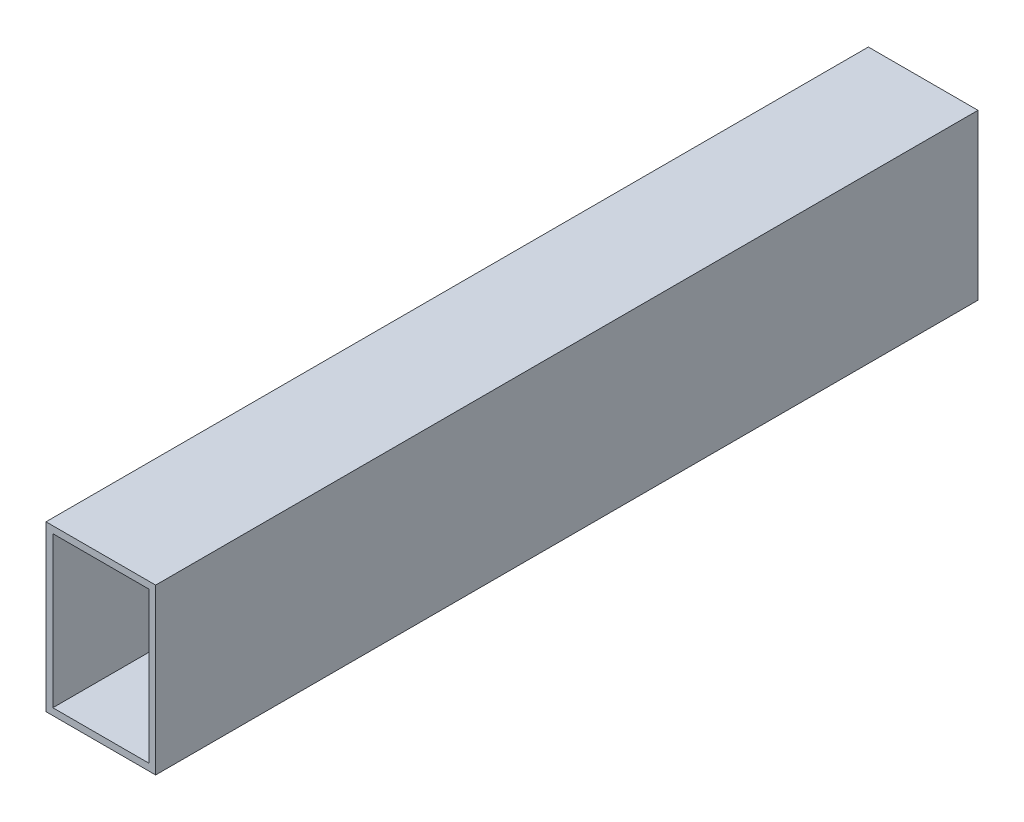
ISO-10303-21;
HEADER;
FILE_DESCRIPTION(('STEP AP214'),'2;1');
FILE_NAME('part.step','',(''),(''),'','','');
FILE_SCHEMA(('AUTOMOTIVE_DESIGN { 1 0 10303 214 1 1 1 1 }'));
ENDSEC;
DATA;
#1=APPLICATION_CONTEXT('core data for automotive mechanical design processes');
#2=APPLICATION_PROTOCOL_DEFINITION('international standard','automotive_design',2000,#1);
#3=PRODUCT_CONTEXT('',#1,'mechanical');
#4=PRODUCT('Part','Part','',(#3));
#5=PRODUCT_RELATED_PRODUCT_CATEGORY('part','',(#4));
#6=PRODUCT_DEFINITION_FORMATION('','',#4);
#7=PRODUCT_DEFINITION_CONTEXT('part definition',#1,'design');
#8=PRODUCT_DEFINITION('design','',#6,#7);
#9=PRODUCT_DEFINITION_SHAPE('','',#8);
#10=(LENGTH_UNIT() NAMED_UNIT(*) SI_UNIT(.MILLI.,.METRE.));
#11=(NAMED_UNIT(*) PLANE_ANGLE_UNIT() SI_UNIT($,.RADIAN.));
#12=(NAMED_UNIT(*) SI_UNIT($,.STERADIAN.) SOLID_ANGLE_UNIT());
#13=UNCERTAINTY_MEASURE_WITH_UNIT(LENGTH_MEASURE(1.E-05),#10,'distance_accuracy_value','');
#14=(GEOMETRIC_REPRESENTATION_CONTEXT(3) GLOBAL_UNCERTAINTY_ASSIGNED_CONTEXT((#13)) GLOBAL_UNIT_ASSIGNED_CONTEXT((#10,
#11,#12)) REPRESENTATION_CONTEXT('',''));
#15=CARTESIAN_POINT('',(0.,0.,0.));
#16=DIRECTION('',(0.,0.,1.));
#17=DIRECTION('',(1.,0.,0.));
#18=AXIS2_PLACEMENT_3D('',#15,#16,#17);
#19=CARTESIAN_POINT('',(0.,0.,381.));
#20=DIRECTION('',(0.,0.,1.));
#21=DIRECTION('',(1.,0.,0.));
#22=AXIS2_PLACEMENT_3D('',#19,#20,#21);
#23=PLANE('',#22);
#24=DIRECTION('',(0.,1.,0.));
#25=VECTOR('',#24,1.);
#26=CARTESIAN_POINT('',(25.4,38.1,381.));
#27=LINE('',#26,#25);
#28=CARTESIAN_POINT('',(25.4,-38.1,381.));
#29=VERTEX_POINT('',#28);
#30=CARTESIAN_POINT('',(25.4,38.1,381.));
#31=VERTEX_POINT('',#30);
#32=EDGE_CURVE('E153',#29,#31,#27,.T.);
#33=ORIENTED_EDGE('',*,*,#32,.T.);
#34=DIRECTION('',(-1.,0.,0.));
#35=VECTOR('',#34,1.);
#36=CARTESIAN_POINT('',(-25.4,38.1,381.));
#37=LINE('',#36,#35);
#38=CARTESIAN_POINT('',(-25.4,38.1,381.));
#39=VERTEX_POINT('',#38);
#40=EDGE_CURVE('E157',#31,#39,#37,.T.);
#41=ORIENTED_EDGE('',*,*,#40,.T.);
#42=DIRECTION('',(0.,-1.,0.));
#43=VECTOR('',#42,1.);
#44=CARTESIAN_POINT('',(-25.4,38.1,381.));
#45=LINE('',#44,#43);
#46=CARTESIAN_POINT('',(-25.3999999999999,-38.1,381.));
#47=VERTEX_POINT('',#46);
#48=EDGE_CURVE('E161',#39,#47,#45,.T.);
#49=ORIENTED_EDGE('',*,*,#48,.T.);
#50=DIRECTION('',(1.,0.,0.));
#51=VECTOR('',#50,1.);
#52=CARTESIAN_POINT('',(-25.3999999999999,-38.1,381.));
#53=LINE('',#52,#51);
#54=EDGE_CURVE('E164',#47,#29,#53,.T.);
#55=ORIENTED_EDGE('',*,*,#54,.T.);
#56=EDGE_LOOP('',(#33,#41,#49,#55));
#57=FACE_BOUND('',#56,.T.);
#58=DIRECTION('',(1.,0.,0.));
#59=VECTOR('',#58,1.);
#60=CARTESIAN_POINT('',(-22.225,-34.925,381.));
#61=LINE('',#60,#59);
#62=CARTESIAN_POINT('',(-22.225,-34.925,381.));
#63=VERTEX_POINT('',#62);
#64=CARTESIAN_POINT('',(22.225,-34.925,381.));
#65=VERTEX_POINT('',#64);
#66=EDGE_CURVE('E114',#63,#65,#61,.T.);
#67=ORIENTED_EDGE('',*,*,#66,.F.);
#68=DIRECTION('',(0.,-1.,0.));
#69=VECTOR('',#68,1.);
#70=CARTESIAN_POINT('',(-22.225,34.925,381.));
#71=LINE('',#70,#69);
#72=CARTESIAN_POINT('',(-22.225,34.925,381.));
#73=VERTEX_POINT('',#72);
#74=EDGE_CURVE('E105',#73,#63,#71,.T.);
#75=ORIENTED_EDGE('',*,*,#74,.F.);
#76=DIRECTION('',(-1.,0.,0.));
#77=VECTOR('',#76,1.);
#78=CARTESIAN_POINT('',(-22.225,34.925,381.));
#79=LINE('',#78,#77);
#80=CARTESIAN_POINT('',(22.225,34.925,381.));
#81=VERTEX_POINT('',#80);
#82=EDGE_CURVE('E131',#81,#73,#79,.T.);
#83=ORIENTED_EDGE('',*,*,#82,.F.);
#84=DIRECTION('',(0.,1.,0.));
#85=VECTOR('',#84,1.);
#86=CARTESIAN_POINT('',(22.225,34.925,381.));
#87=LINE('',#86,#85);
#88=EDGE_CURVE('E127',#65,#81,#87,.T.);
#89=ORIENTED_EDGE('',*,*,#88,.F.);
#90=EDGE_LOOP('',(#67,#75,#83,#89));
#91=FACE_BOUND('',#90,.T.);
#92=ADVANCED_FACE('F39',(#57,#91),#23,.T.);
#93=CARTESIAN_POINT('',(0.,0.,0.));
#94=DIRECTION('',(0.,0.,1.));
#95=DIRECTION('',(1.,0.,0.));
#96=AXIS2_PLACEMENT_3D('',#93,#94,#95);
#97=PLANE('',#96);
#98=DIRECTION('',(0.,1.,0.));
#99=VECTOR('',#98,1.);
#100=CARTESIAN_POINT('',(25.4,38.1,0.));
#101=LINE('',#100,#99);
#102=CARTESIAN_POINT('',(25.4,-38.1,0.));
#103=VERTEX_POINT('',#102);
#104=CARTESIAN_POINT('',(25.4,38.1,0.));
#105=VERTEX_POINT('',#104);
#106=EDGE_CURVE('E123',#103,#105,#101,.T.);
#107=ORIENTED_EDGE('',*,*,#106,.F.);
#108=DIRECTION('',(1.,0.,0.));
#109=VECTOR('',#108,1.);
#110=CARTESIAN_POINT('',(-25.3999999999999,-38.1,0.));
#111=LINE('',#110,#109);
#112=CARTESIAN_POINT('',(-25.3999999999999,-38.1,0.));
#113=VERTEX_POINT('',#112);
#114=EDGE_CURVE('E158',#113,#103,#111,.T.);
#115=ORIENTED_EDGE('',*,*,#114,.F.);
#116=DIRECTION('',(0.,-1.,0.));
#117=VECTOR('',#116,1.);
#118=CARTESIAN_POINT('',(-25.4,38.1,0.));
#119=LINE('',#118,#117);
#120=CARTESIAN_POINT('',(-25.4,38.1,0.));
#121=VERTEX_POINT('',#120);
#122=EDGE_CURVE('E174',#121,#113,#119,.T.);
#123=ORIENTED_EDGE('',*,*,#122,.F.);
#124=DIRECTION('',(-1.,0.,0.));
#125=VECTOR('',#124,1.);
#126=CARTESIAN_POINT('',(-25.4,38.1,0.));
#127=LINE('',#126,#125);
#128=EDGE_CURVE('E171',#105,#121,#127,.T.);
#129=ORIENTED_EDGE('',*,*,#128,.F.);
#130=EDGE_LOOP('',(#107,#115,#123,#129));
#131=FACE_BOUND('',#130,.T.);
#132=DIRECTION('',(0.,-1.,0.));
#133=VECTOR('',#132,1.);
#134=CARTESIAN_POINT('',(-22.225,34.925,0.));
#135=LINE('',#134,#133);
#136=CARTESIAN_POINT('',(-22.225,34.925,0.));
#137=VERTEX_POINT('',#136);
#138=CARTESIAN_POINT('',(-22.225,-34.925,0.));
#139=VERTEX_POINT('',#138);
#140=EDGE_CURVE('E63',#137,#139,#135,.T.);
#141=ORIENTED_EDGE('',*,*,#140,.T.);
#142=DIRECTION('',(1.,0.,0.));
#143=VECTOR('',#142,1.);
#144=CARTESIAN_POINT('',(-22.225,-34.925,0.));
#145=LINE('',#144,#143);
#146=CARTESIAN_POINT('',(22.225,-34.925,0.));
#147=VERTEX_POINT('',#146);
#148=EDGE_CURVE('E121',#139,#147,#145,.T.);
#149=ORIENTED_EDGE('',*,*,#148,.T.);
#150=DIRECTION('',(0.,1.,0.));
#151=VECTOR('',#150,1.);
#152=CARTESIAN_POINT('',(22.225,34.925,0.));
#153=LINE('',#152,#151);
#154=CARTESIAN_POINT('',(22.225,34.925,0.));
#155=VERTEX_POINT('',#154);
#156=EDGE_CURVE('E140',#147,#155,#153,.T.);
#157=ORIENTED_EDGE('',*,*,#156,.T.);
#158=DIRECTION('',(-1.,0.,0.));
#159=VECTOR('',#158,1.);
#160=CARTESIAN_POINT('',(-22.225,34.925,0.));
#161=LINE('',#160,#159);
#162=EDGE_CURVE('E115',#155,#137,#161,.T.);
#163=ORIENTED_EDGE('',*,*,#162,.T.);
#164=EDGE_LOOP('',(#141,#149,#157,#163));
#165=FACE_BOUND('',#164,.T.);
#166=ADVANCED_FACE('F197',(#131,#165),#97,.F.);
#167=CARTESIAN_POINT('',(25.4,38.1,381.));
#168=DIRECTION('',(-1.,0.,0.));
#169=DIRECTION('',(0.,-1.,0.));
#170=AXIS2_PLACEMENT_3D('',#167,#168,#169);
#171=PLANE('',#170);
#172=ORIENTED_EDGE('',*,*,#106,.T.);
#173=DIRECTION('',(0.,0.,-1.));
#174=VECTOR('',#173,1.);
#175=CARTESIAN_POINT('',(25.4,38.1,381.));
#176=LINE('',#175,#174);
#177=EDGE_CURVE('E11',#31,#105,#176,.T.);
#178=ORIENTED_EDGE('',*,*,#177,.F.);
#179=ORIENTED_EDGE('',*,*,#32,.F.);
#180=DIRECTION('',(0.,0.,-1.));
#181=VECTOR('',#180,1.);
#182=CARTESIAN_POINT('',(25.4,-38.1,381.));
#183=LINE('',#182,#181);
#184=EDGE_CURVE('E167',#29,#103,#183,.T.);
#185=ORIENTED_EDGE('',*,*,#184,.T.);
#186=EDGE_LOOP('',(#172,#178,#179,#185));
#187=FACE_BOUND('',#186,.T.);
#188=ADVANCED_FACE('F41',(#187),#171,.F.);
#189=CARTESIAN_POINT('',(-25.4,38.1,381.));
#190=DIRECTION('',(0.,-1.,0.));
#191=DIRECTION('',(0.,0.,-1.));
#192=AXIS2_PLACEMENT_3D('',#189,#190,#191);
#193=PLANE('',#192);
#194=ORIENTED_EDGE('',*,*,#128,.T.);
#195=DIRECTION('',(0.,0.,-1.));
#196=VECTOR('',#195,1.);
#197=CARTESIAN_POINT('',(-25.4,38.1,381.));
#198=LINE('',#197,#196);
#199=EDGE_CURVE('E48',#39,#121,#198,.T.);
#200=ORIENTED_EDGE('',*,*,#199,.F.);
#201=ORIENTED_EDGE('',*,*,#40,.F.);
#202=ORIENTED_EDGE('',*,*,#177,.T.);
#203=EDGE_LOOP('',(#194,#200,#201,#202));
#204=FACE_BOUND('',#203,.T.);
#205=ADVANCED_FACE('F207',(#204),#193,.F.);
#206=CARTESIAN_POINT('',(-25.4,38.1,381.));
#207=DIRECTION('',(1.,0.,0.));
#208=DIRECTION('',(0.,1.,0.));
#209=AXIS2_PLACEMENT_3D('',#206,#207,#208);
#210=PLANE('',#209);
#211=ORIENTED_EDGE('',*,*,#122,.T.);
#212=DIRECTION('',(0.,0.,-1.));
#213=VECTOR('',#212,1.);
#214=CARTESIAN_POINT('',(-25.3999999999999,-38.1,381.));
#215=LINE('',#214,#213);
#216=EDGE_CURVE('E182',#47,#113,#215,.T.);
#217=ORIENTED_EDGE('',*,*,#216,.F.);
#218=ORIENTED_EDGE('',*,*,#48,.F.);
#219=ORIENTED_EDGE('',*,*,#199,.T.);
#220=EDGE_LOOP('',(#211,#217,#218,#219));
#221=FACE_BOUND('',#220,.T.);
#222=ADVANCED_FACE('F191',(#221),#210,.F.);
#223=CARTESIAN_POINT('',(-25.3999999999999,-38.1,381.));
#224=DIRECTION('',(0.,1.,0.));
#225=DIRECTION('',(0.,0.,1.));
#226=AXIS2_PLACEMENT_3D('',#223,#224,#225);
#227=PLANE('',#226);
#228=ORIENTED_EDGE('',*,*,#114,.T.);
#229=ORIENTED_EDGE('',*,*,#184,.F.);
#230=ORIENTED_EDGE('',*,*,#54,.F.);
#231=ORIENTED_EDGE('',*,*,#216,.T.);
#232=EDGE_LOOP('',(#228,#229,#230,#231));
#233=FACE_BOUND('',#232,.T.);
#234=ADVANCED_FACE('F201',(#233),#227,.F.);
#235=CARTESIAN_POINT('',(-22.225,34.925,381.));
#236=DIRECTION('',(1.,0.,0.));
#237=DIRECTION('',(0.,1.,0.));
#238=AXIS2_PLACEMENT_3D('',#235,#236,#237);
#239=PLANE('',#238);
#240=ORIENTED_EDGE('',*,*,#140,.F.);
#241=DIRECTION('',(0.,0.,-1.));
#242=VECTOR('',#241,1.);
#243=CARTESIAN_POINT('',(-22.225,34.925,381.));
#244=LINE('',#243,#242);
#245=EDGE_CURVE('E109',#73,#137,#244,.T.);
#246=ORIENTED_EDGE('',*,*,#245,.F.);
#247=ORIENTED_EDGE('',*,*,#74,.T.);
#248=DIRECTION('',(0.,0.,-1.));
#249=VECTOR('',#248,1.);
#250=CARTESIAN_POINT('',(-22.225,-34.925,381.));
#251=LINE('',#250,#249);
#252=EDGE_CURVE('E108',#63,#139,#251,.T.);
#253=ORIENTED_EDGE('',*,*,#252,.T.);
#254=EDGE_LOOP('',(#240,#246,#247,#253));
#255=FACE_BOUND('',#254,.T.);
#256=ADVANCED_FACE('F107',(#255),#239,.T.);
#257=CARTESIAN_POINT('',(-22.225,-34.925,381.));
#258=DIRECTION('',(0.,1.,0.));
#259=DIRECTION('',(-1.,0.,0.));
#260=AXIS2_PLACEMENT_3D('',#257,#258,#259);
#261=PLANE('',#260);
#262=ORIENTED_EDGE('',*,*,#148,.F.);
#263=ORIENTED_EDGE('',*,*,#252,.F.);
#264=ORIENTED_EDGE('',*,*,#66,.T.);
#265=DIRECTION('',(0.,0.,-1.));
#266=VECTOR('',#265,1.);
#267=CARTESIAN_POINT('',(22.225,-34.925,381.));
#268=LINE('',#267,#266);
#269=EDGE_CURVE('E124',#65,#147,#268,.T.);
#270=ORIENTED_EDGE('',*,*,#269,.T.);
#271=EDGE_LOOP('',(#262,#263,#264,#270));
#272=FACE_BOUND('',#271,.T.);
#273=ADVANCED_FACE('F118',(#272),#261,.T.);
#274=CARTESIAN_POINT('',(22.225,34.925,381.));
#275=DIRECTION('',(-1.,0.,0.));
#276=DIRECTION('',(0.,-1.,0.));
#277=AXIS2_PLACEMENT_3D('',#274,#275,#276);
#278=PLANE('',#277);
#279=ORIENTED_EDGE('',*,*,#156,.F.);
#280=ORIENTED_EDGE('',*,*,#269,.F.);
#281=ORIENTED_EDGE('',*,*,#88,.T.);
#282=DIRECTION('',(0.,0.,-1.));
#283=VECTOR('',#282,1.);
#284=CARTESIAN_POINT('',(22.225,34.925,381.));
#285=LINE('',#284,#283);
#286=EDGE_CURVE('E55',#81,#155,#285,.T.);
#287=ORIENTED_EDGE('',*,*,#286,.T.);
#288=EDGE_LOOP('',(#279,#280,#281,#287));
#289=FACE_BOUND('',#288,.T.);
#290=ADVANCED_FACE('F230',(#289),#278,.T.);
#291=CARTESIAN_POINT('',(-22.225,34.925,381.));
#292=DIRECTION('',(0.,-1.,0.));
#293=DIRECTION('',(1.,0.,0.));
#294=AXIS2_PLACEMENT_3D('',#291,#292,#293);
#295=PLANE('',#294);
#296=ORIENTED_EDGE('',*,*,#162,.F.);
#297=ORIENTED_EDGE('',*,*,#286,.F.);
#298=ORIENTED_EDGE('',*,*,#82,.T.);
#299=ORIENTED_EDGE('',*,*,#245,.T.);
#300=EDGE_LOOP('',(#296,#297,#298,#299));
#301=FACE_BOUND('',#300,.T.);
#302=ADVANCED_FACE('F234',(#301),#295,.T.);
#303=CLOSED_SHELL('',(#92,#166,#188,#205,#222,#234,#256,#273,#290,#302));
#304=MANIFOLD_SOLID_BREP('B2',#303);
#305=ADVANCED_BREP_SHAPE_REPRESENTATION('',(#18,#304),#14);
#306=SHAPE_DEFINITION_REPRESENTATION(#9,#305);
ENDSEC;
END-ISO-10303-21;
